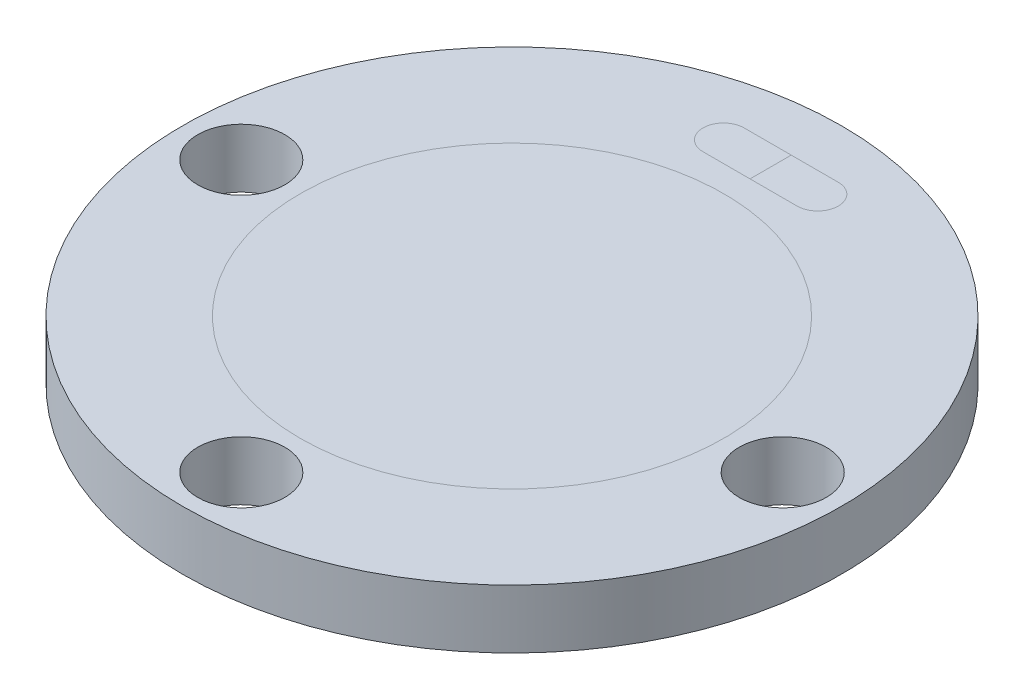
ISO-10303-21;
HEADER;
FILE_DESCRIPTION(('STEP AP214'),'2;1');
FILE_NAME('part.step','',(''),(''),'','','');
FILE_SCHEMA(('AUTOMOTIVE_DESIGN { 1 0 10303 214 1 1 1 1 }'));
ENDSEC;
DATA;
#1=APPLICATION_CONTEXT('core data for automotive mechanical design processes');
#2=APPLICATION_PROTOCOL_DEFINITION('international standard','automotive_design',2000,#1);
#3=PRODUCT_CONTEXT('',#1,'mechanical');
#4=PRODUCT('Part','Part','',(#3));
#5=PRODUCT_RELATED_PRODUCT_CATEGORY('part','',(#4));
#6=PRODUCT_DEFINITION_FORMATION('','',#4);
#7=PRODUCT_DEFINITION_CONTEXT('part definition',#1,'design');
#8=PRODUCT_DEFINITION('design','',#6,#7);
#9=PRODUCT_DEFINITION_SHAPE('','',#8);
#10=(LENGTH_UNIT() NAMED_UNIT(*) SI_UNIT(.MILLI.,.METRE.));
#11=(NAMED_UNIT(*) PLANE_ANGLE_UNIT() SI_UNIT($,.RADIAN.));
#12=(NAMED_UNIT(*) SI_UNIT($,.STERADIAN.) SOLID_ANGLE_UNIT());
#13=UNCERTAINTY_MEASURE_WITH_UNIT(LENGTH_MEASURE(1.E-05),#10,'distance_accuracy_value','');
#14=(GEOMETRIC_REPRESENTATION_CONTEXT(3) GLOBAL_UNCERTAINTY_ASSIGNED_CONTEXT((#13)) GLOBAL_UNIT_ASSIGNED_CONTEXT((#10,
#11,#12)) REPRESENTATION_CONTEXT('',''));
#15=CARTESIAN_POINT('',(0.,0.,0.));
#16=DIRECTION('',(0.,0.,1.));
#17=DIRECTION('',(1.,0.,0.));
#18=AXIS2_PLACEMENT_3D('',#15,#16,#17);
#19=CARTESIAN_POINT('',(0.,3.,0.));
#20=DIRECTION('',(0.,1.,0.));
#21=DIRECTION('',(0.,0.,1.));
#22=AXIS2_PLACEMENT_3D('',#19,#20,#21);
#23=PLANE('',#22);
#24=DIRECTION('',(-1.,0.,0.));
#25=VECTOR('',#24,1.);
#26=CARTESIAN_POINT('',(0.,3.,-20.202434773887));
#27=LINE('',#26,#25);
#28=CARTESIAN_POINT('',(0.0218218594718357,3.,-20.202434773887));
#29=VERTEX_POINT('',#28);
#30=CARTESIAN_POINT('',(-3.97817814052816,3.,-20.202434773887));
#31=VERTEX_POINT('',#30);
#32=EDGE_CURVE('E94',#29,#31,#27,.T.);
#33=ORIENTED_EDGE('',*,*,#32,.F.);
#34=DIRECTION('',(0.,0.,-1.));
#35=VECTOR('',#34,1.);
#36=CARTESIAN_POINT('',(0.0218218594718357,3.,0.));
#37=LINE('',#36,#35);
#38=CARTESIAN_POINT('',(0.0218218594718357,3.,-23.702434773887));
#39=VERTEX_POINT('',#38);
#40=EDGE_CURVE('E11',#29,#39,#37,.T.);
#41=ORIENTED_EDGE('',*,*,#40,.T.);
#42=DIRECTION('',(1.,0.,0.));
#43=VECTOR('',#42,1.);
#44=CARTESIAN_POINT('',(0.,3.,-23.702434773887));
#45=LINE('',#44,#43);
#46=CARTESIAN_POINT('',(-3.97817814052816,3.,-23.702434773887));
#47=VERTEX_POINT('',#46);
#48=EDGE_CURVE('E90',#47,#39,#45,.T.);
#49=ORIENTED_EDGE('',*,*,#48,.F.);
#50=CARTESIAN_POINT('',(-3.97817814052816,3.,-21.952434773887));
#51=DIRECTION('',(0.,1.,0.));
#52=DIRECTION('',(0.,0.,1.));
#53=AXIS2_PLACEMENT_3D('',#50,#51,#52);
#54=CIRCLE('',#53,1.75);
#55=EDGE_CURVE('E93',#31,#47,#54,.F.);
#56=ORIENTED_EDGE('',*,*,#55,.F.);
#57=EDGE_LOOP('',(#33,#41,#49,#56));
#58=FACE_BOUND('',#57,.T.);
#59=ADVANCED_FACE('F53',(#58),#23,.T.);
#60=CARTESIAN_POINT('',(0.,3.,23.));
#61=DIRECTION('',(0.,1.,0.));
#62=DIRECTION('',(0.,0.,1.));
#63=AXIS2_PLACEMENT_3D('',#60,#61,#62);
#64=CIRCLE('',#63,3.7);
#65=CARTESIAN_POINT('',(0.,3.,26.7));
#66=VERTEX_POINT('',#65);
#67=EDGE_CURVE('E138',#66,#66,#64,.T.);
#68=ORIENTED_EDGE('',*,*,#67,.F.);
#69=EDGE_LOOP('',(#68));
#70=FACE_BOUND('',#69,.T.);
#71=CARTESIAN_POINT('',(-23.,3.,0.));
#72=DIRECTION('',(0.,1.,0.));
#73=DIRECTION('',(0.,0.,1.));
#74=AXIS2_PLACEMENT_3D('',#71,#72,#73);
#75=CIRCLE('',#74,3.7);
#76=CARTESIAN_POINT('',(-23.,3.,3.7));
#77=VERTEX_POINT('',#76);
#78=EDGE_CURVE('E134',#77,#77,#75,.T.);
#79=ORIENTED_EDGE('',*,*,#78,.F.);
#80=EDGE_LOOP('',(#79));
#81=FACE_BOUND('',#80,.T.);
#82=CARTESIAN_POINT('',(23.,3.,0.));
#83=DIRECTION('',(0.,1.,0.));
#84=DIRECTION('',(0.,0.,1.));
#85=AXIS2_PLACEMENT_3D('',#82,#83,#84);
#86=CIRCLE('',#85,3.7);
#87=CARTESIAN_POINT('',(23.,3.,3.7));
#88=VERTEX_POINT('',#87);
#89=EDGE_CURVE('E131',#88,#88,#86,.T.);
#90=ORIENTED_EDGE('',*,*,#89,.F.);
#91=EDGE_LOOP('',(#90));
#92=FACE_BOUND('',#91,.T.);
#93=CARTESIAN_POINT('',(0.,3.,0.));
#94=DIRECTION('',(0.,1.,0.));
#95=DIRECTION('',(0.,0.,1.));
#96=AXIS2_PLACEMENT_3D('',#93,#94,#95);
#97=CIRCLE('',#96,28.);
#98=CARTESIAN_POINT('',(0.,3.,28.));
#99=VERTEX_POINT('',#98);
#100=EDGE_CURVE('E127',#99,#99,#97,.T.);
#101=ORIENTED_EDGE('',*,*,#100,.T.);
#102=EDGE_LOOP('',(#101));
#103=FACE_BOUND('',#102,.T.);
#104=CARTESIAN_POINT('',(0.,3.,0.));
#105=DIRECTION('',(0.,1.,0.));
#106=DIRECTION('',(0.,0.,1.));
#107=AXIS2_PLACEMENT_3D('',#104,#105,#106);
#108=CIRCLE('',#107,18.);
#109=CARTESIAN_POINT('',(0.,3.,18.));
#110=VERTEX_POINT('',#109);
#111=EDGE_CURVE('E101',#110,#110,#108,.F.);
#112=ORIENTED_EDGE('',*,*,#111,.T.);
#113=EDGE_LOOP('',(#112));
#114=FACE_BOUND('',#113,.T.);
#115=ORIENTED_EDGE('',*,*,#48,.T.);
#116=CARTESIAN_POINT('',(4.02182185947184,3.,-23.702434773887));
#117=VERTEX_POINT('',#116);
#118=EDGE_CURVE('E88',#39,#117,#45,.T.);
#119=ORIENTED_EDGE('',*,*,#118,.T.);
#120=CARTESIAN_POINT('',(4.02182185947184,3.,-21.952434773887));
#121=DIRECTION('',(0.,1.,0.));
#122=DIRECTION('',(0.,0.,1.));
#123=AXIS2_PLACEMENT_3D('',#120,#121,#122);
#124=CIRCLE('',#123,1.75);
#125=CARTESIAN_POINT('',(4.02182185947184,3.,-20.202434773887));
#126=VERTEX_POINT('',#125);
#127=EDGE_CURVE('E62',#117,#126,#124,.F.);
#128=ORIENTED_EDGE('',*,*,#127,.T.);
#129=EDGE_CURVE('E87',#126,#29,#27,.T.);
#130=ORIENTED_EDGE('',*,*,#129,.T.);
#131=ORIENTED_EDGE('',*,*,#32,.T.);
#132=ORIENTED_EDGE('',*,*,#55,.T.);
#133=EDGE_LOOP('',(#115,#119,#128,#130,#131,#132));
#134=FACE_BOUND('',#133,.T.);
#135=ADVANCED_FACE('F86',(#70,#81,#92,#103,#114,#134),#23,.T.);
#136=ORIENTED_EDGE('',*,*,#40,.F.);
#137=ORIENTED_EDGE('',*,*,#129,.F.);
#138=ORIENTED_EDGE('',*,*,#127,.F.);
#139=ORIENTED_EDGE('',*,*,#118,.F.);
#140=EDGE_LOOP('',(#136,#137,#138,#139));
#141=FACE_BOUND('',#140,.T.);
#142=ADVANCED_FACE('F91',(#141),#23,.T.);
#143=CARTESIAN_POINT('',(0.,3.,0.));
#144=DIRECTION('',(0.,-1.,0.));
#145=DIRECTION('',(0.,0.,-1.));
#146=AXIS2_PLACEMENT_3D('',#143,#144,#145);
#147=CYLINDRICAL_SURFACE('',#146,28.);
#148=ORIENTED_EDGE('',*,*,#100,.F.);
#149=EDGE_LOOP('',(#148));
#150=FACE_BOUND('',#149,.T.);
#151=CARTESIAN_POINT('',(0.,-2.,0.));
#152=DIRECTION('',(0.,1.,0.));
#153=DIRECTION('',(0.,0.,1.));
#154=AXIS2_PLACEMENT_3D('',#151,#152,#153);
#155=CIRCLE('',#154,28.);
#156=CARTESIAN_POINT('',(0.,-2.,28.));
#157=VERTEX_POINT('',#156);
#158=EDGE_CURVE('E142',#157,#157,#155,.T.);
#159=ORIENTED_EDGE('',*,*,#158,.T.);
#160=EDGE_LOOP('',(#159));
#161=FACE_BOUND('',#160,.T.);
#162=ADVANCED_FACE('F55',(#150,#161),#147,.T.);
#163=ORIENTED_EDGE('',*,*,#111,.F.);
#164=EDGE_LOOP('',(#163));
#165=FACE_BOUND('',#164,.T.);
#166=ADVANCED_FACE('F166',(#165),#23,.T.);
#167=CARTESIAN_POINT('',(23.,-7.,0.));
#168=DIRECTION('',(0.,1.,0.));
#169=DIRECTION('',(0.,0.,1.));
#170=AXIS2_PLACEMENT_3D('',#167,#168,#169);
#171=CYLINDRICAL_SURFACE('',#170,3.7);
#172=ORIENTED_EDGE('',*,*,#89,.T.);
#173=EDGE_LOOP('',(#172));
#174=FACE_BOUND('',#173,.T.);
#175=CARTESIAN_POINT('',(23.,-2.,0.));
#176=DIRECTION('',(0.,1.,0.));
#177=DIRECTION('',(0.,0.,1.));
#178=AXIS2_PLACEMENT_3D('',#175,#176,#177);
#179=CIRCLE('',#178,3.7);
#180=CARTESIAN_POINT('',(23.,-2.,3.7));
#181=VERTEX_POINT('',#180);
#182=EDGE_CURVE('E154',#181,#181,#179,.T.);
#183=ORIENTED_EDGE('',*,*,#182,.F.);
#184=EDGE_LOOP('',(#183));
#185=FACE_BOUND('',#184,.T.);
#186=ADVANCED_FACE('F163',(#174,#185),#171,.F.);
#187=CARTESIAN_POINT('',(-23.,-7.,0.));
#188=DIRECTION('',(0.,1.,0.));
#189=DIRECTION('',(0.,0.,1.));
#190=AXIS2_PLACEMENT_3D('',#187,#188,#189);
#191=CYLINDRICAL_SURFACE('',#190,3.7);
#192=ORIENTED_EDGE('',*,*,#78,.T.);
#193=EDGE_LOOP('',(#192));
#194=FACE_BOUND('',#193,.T.);
#195=CARTESIAN_POINT('',(-23.,-2.,0.));
#196=DIRECTION('',(0.,1.,0.));
#197=DIRECTION('',(0.,0.,1.));
#198=AXIS2_PLACEMENT_3D('',#195,#196,#197);
#199=CIRCLE('',#198,3.7);
#200=CARTESIAN_POINT('',(-23.,-2.,3.7));
#201=VERTEX_POINT('',#200);
#202=EDGE_CURVE('E150',#201,#201,#199,.T.);
#203=ORIENTED_EDGE('',*,*,#202,.F.);
#204=EDGE_LOOP('',(#203));
#205=FACE_BOUND('',#204,.T.);
#206=ADVANCED_FACE('F165',(#194,#205),#191,.F.);
#207=CARTESIAN_POINT('',(0.,-7.,23.));
#208=DIRECTION('',(0.,1.,0.));
#209=DIRECTION('',(0.,0.,1.));
#210=AXIS2_PLACEMENT_3D('',#207,#208,#209);
#211=CYLINDRICAL_SURFACE('',#210,3.7);
#212=ORIENTED_EDGE('',*,*,#67,.T.);
#213=EDGE_LOOP('',(#212));
#214=FACE_BOUND('',#213,.T.);
#215=CARTESIAN_POINT('',(0.,-2.,23.));
#216=DIRECTION('',(0.,1.,0.));
#217=DIRECTION('',(0.,0.,1.));
#218=AXIS2_PLACEMENT_3D('',#215,#216,#217);
#219=CIRCLE('',#218,3.7);
#220=CARTESIAN_POINT('',(0.,-2.,26.7));
#221=VERTEX_POINT('',#220);
#222=EDGE_CURVE('E146',#221,#221,#219,.T.);
#223=ORIENTED_EDGE('',*,*,#222,.F.);
#224=EDGE_LOOP('',(#223));
#225=FACE_BOUND('',#224,.T.);
#226=ADVANCED_FACE('F173',(#214,#225),#211,.F.);
#227=CARTESIAN_POINT('',(0.,-2.,0.));
#228=DIRECTION('',(0.,1.,0.));
#229=DIRECTION('',(0.,0.,1.));
#230=AXIS2_PLACEMENT_3D('',#227,#228,#229);
#231=PLANE('',#230);
#232=ORIENTED_EDGE('',*,*,#182,.T.);
#233=EDGE_LOOP('',(#232));
#234=FACE_BOUND('',#233,.T.);
#235=ORIENTED_EDGE('',*,*,#202,.T.);
#236=EDGE_LOOP('',(#235));
#237=FACE_BOUND('',#236,.T.);
#238=ORIENTED_EDGE('',*,*,#222,.T.);
#239=EDGE_LOOP('',(#238));
#240=FACE_BOUND('',#239,.T.);
#241=ORIENTED_EDGE('',*,*,#158,.F.);
#242=EDGE_LOOP('',(#241));
#243=FACE_BOUND('',#242,.T.);
#244=ADVANCED_FACE('F160',(#234,#237,#240,#243),#231,.F.);
#245=CLOSED_SHELL('',(#59,#135,#142,#162,#166,#186,#206,#226,#244));
#246=MANIFOLD_SOLID_BREP('B2',#245);
#247=ADVANCED_BREP_SHAPE_REPRESENTATION('',(#18,#246),#14);
#248=SHAPE_DEFINITION_REPRESENTATION(#9,#247);
ENDSEC;
END-ISO-10303-21;
